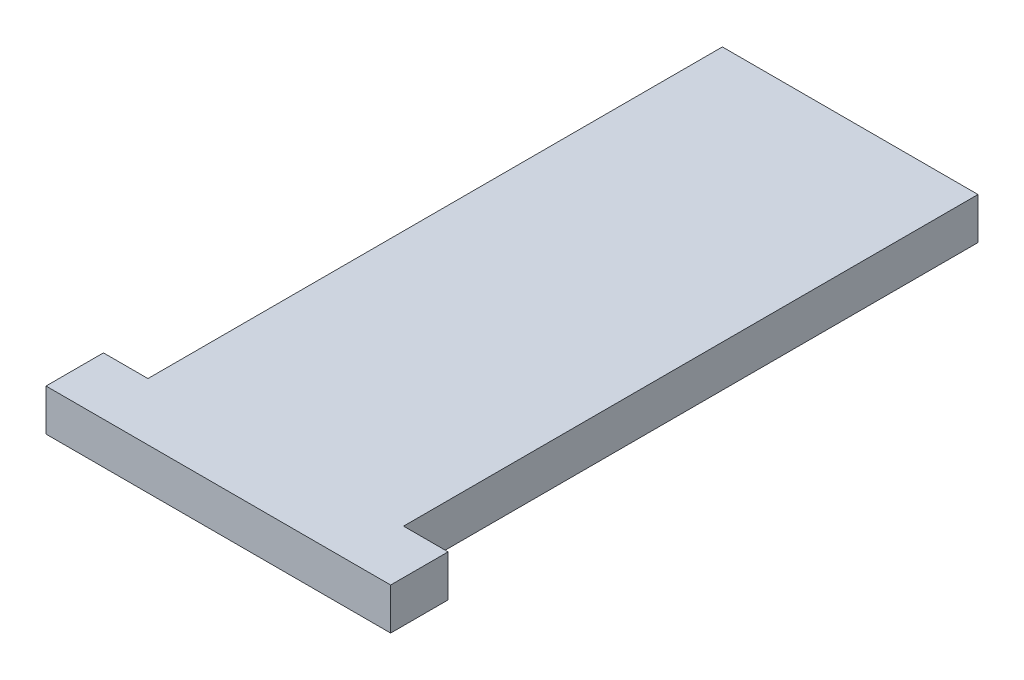
ISO-10303-21;
HEADER;
FILE_DESCRIPTION(('STEP AP214'),'2;1');
FILE_NAME('part.step','',(''),(''),'','','');
FILE_SCHEMA(('AUTOMOTIVE_DESIGN { 1 0 10303 214 1 1 1 1 }'));
ENDSEC;
DATA;
#1=APPLICATION_CONTEXT('core data for automotive mechanical design processes');
#2=APPLICATION_PROTOCOL_DEFINITION('international standard','automotive_design',2000,#1);
#3=PRODUCT_CONTEXT('',#1,'mechanical');
#4=PRODUCT('Part','Part','',(#3));
#5=PRODUCT_RELATED_PRODUCT_CATEGORY('part','',(#4));
#6=PRODUCT_DEFINITION_FORMATION('','',#4);
#7=PRODUCT_DEFINITION_CONTEXT('part definition',#1,'design');
#8=PRODUCT_DEFINITION('design','',#6,#7);
#9=PRODUCT_DEFINITION_SHAPE('','',#8);
#10=(LENGTH_UNIT() NAMED_UNIT(*) SI_UNIT(.MILLI.,.METRE.));
#11=(NAMED_UNIT(*) PLANE_ANGLE_UNIT() SI_UNIT($,.RADIAN.));
#12=(NAMED_UNIT(*) SI_UNIT($,.STERADIAN.) SOLID_ANGLE_UNIT());
#13=UNCERTAINTY_MEASURE_WITH_UNIT(LENGTH_MEASURE(1.E-05),#10,'distance_accuracy_value','');
#14=(GEOMETRIC_REPRESENTATION_CONTEXT(3) GLOBAL_UNCERTAINTY_ASSIGNED_CONTEXT((#13)) GLOBAL_UNIT_ASSIGNED_CONTEXT((#10,
#11,#12)) REPRESENTATION_CONTEXT('',''));
#15=CARTESIAN_POINT('',(0.,0.,0.));
#16=DIRECTION('',(0.,0.,1.));
#17=DIRECTION('',(1.,0.,0.));
#18=AXIS2_PLACEMENT_3D('',#15,#16,#17);
#19=CARTESIAN_POINT('',(0.,3.683,-5.08));
#20=DIRECTION('',(-1.,0.,0.));
#21=DIRECTION('',(0.,0.,1.));
#22=AXIS2_PLACEMENT_3D('',#19,#20,#21);
#23=PLANE('',#22);
#24=DIRECTION('',(0.,0.,-1.));
#25=VECTOR('',#24,1.);
#26=CARTESIAN_POINT('',(0.,0.,-5.08));
#27=LINE('',#26,#25);
#28=CARTESIAN_POINT('',(0.,0.,0.));
#29=VERTEX_POINT('',#28);
#30=CARTESIAN_POINT('',(0.,0.,-5.08));
#31=VERTEX_POINT('',#30);
#32=EDGE_CURVE('E146',#29,#31,#27,.T.);
#33=ORIENTED_EDGE('',*,*,#32,.T.);
#34=DIRECTION('',(0.,-1.,0.));
#35=VECTOR('',#34,1.);
#36=CARTESIAN_POINT('',(0.,3.683,-5.08));
#37=LINE('',#36,#35);
#38=CARTESIAN_POINT('',(0.,3.683,-5.08));
#39=VERTEX_POINT('',#38);
#40=EDGE_CURVE('E11',#39,#31,#37,.T.);
#41=ORIENTED_EDGE('',*,*,#40,.F.);
#42=DIRECTION('',(0.,0.,-1.));
#43=VECTOR('',#42,1.);
#44=CARTESIAN_POINT('',(0.,3.683,-5.08));
#45=LINE('',#44,#43);
#46=CARTESIAN_POINT('',(0.,3.683,0.));
#47=VERTEX_POINT('',#46);
#48=EDGE_CURVE('E168',#47,#39,#45,.T.);
#49=ORIENTED_EDGE('',*,*,#48,.F.);
#50=DIRECTION('',(0.,-1.,0.));
#51=VECTOR('',#50,1.);
#52=CARTESIAN_POINT('',(0.,3.683,0.));
#53=LINE('',#52,#51);
#54=EDGE_CURVE('E142',#47,#29,#53,.T.);
#55=ORIENTED_EDGE('',*,*,#54,.T.);
#56=EDGE_LOOP('',(#33,#41,#49,#55));
#57=FACE_BOUND('',#56,.T.);
#58=ADVANCED_FACE('F45',(#57),#23,.F.);
#59=CARTESIAN_POINT('',(-3.937,3.683,-5.08));
#60=DIRECTION('',(0.,0.,1.));
#61=DIRECTION('',(1.,0.,0.));
#62=AXIS2_PLACEMENT_3D('',#59,#60,#61);
#63=PLANE('',#62);
#64=DIRECTION('',(-1.,0.,0.));
#65=VECTOR('',#64,1.);
#66=CARTESIAN_POINT('',(-3.937,0.,-5.08));
#67=LINE('',#66,#65);
#68=CARTESIAN_POINT('',(-3.937,0.,-5.08));
#69=VERTEX_POINT('',#68);
#70=EDGE_CURVE('E150',#31,#69,#67,.T.);
#71=ORIENTED_EDGE('',*,*,#70,.T.);
#72=DIRECTION('',(0.,-1.,0.));
#73=VECTOR('',#72,1.);
#74=CARTESIAN_POINT('',(-3.937,3.683,-5.08));
#75=LINE('',#74,#73);
#76=CARTESIAN_POINT('',(-3.937,3.683,-5.08));
#77=VERTEX_POINT('',#76);
#78=EDGE_CURVE('E54',#77,#69,#75,.T.);
#79=ORIENTED_EDGE('',*,*,#78,.F.);
#80=DIRECTION('',(-1.,0.,0.));
#81=VECTOR('',#80,1.);
#82=CARTESIAN_POINT('',(-3.937,3.683,-5.08));
#83=LINE('',#82,#81);
#84=EDGE_CURVE('E105',#39,#77,#83,.T.);
#85=ORIENTED_EDGE('',*,*,#84,.F.);
#86=ORIENTED_EDGE('',*,*,#40,.T.);
#87=EDGE_LOOP('',(#71,#79,#85,#86));
#88=FACE_BOUND('',#87,.T.);
#89=ADVANCED_FACE('F214',(#88),#63,.F.);
#90=CARTESIAN_POINT('',(-3.937,3.683,-55.88));
#91=DIRECTION('',(-1.,0.,0.));
#92=DIRECTION('',(0.,0.,1.));
#93=AXIS2_PLACEMENT_3D('',#90,#91,#92);
#94=PLANE('',#93);
#95=DIRECTION('',(0.,0.,-1.));
#96=VECTOR('',#95,1.);
#97=CARTESIAN_POINT('',(-3.937,0.,-55.88));
#98=LINE('',#97,#96);
#99=CARTESIAN_POINT('',(-3.937,0.,-55.88));
#100=VERTEX_POINT('',#99);
#101=EDGE_CURVE('E153',#69,#100,#98,.T.);
#102=ORIENTED_EDGE('',*,*,#101,.T.);
#103=DIRECTION('',(0.,-1.,0.));
#104=VECTOR('',#103,1.);
#105=CARTESIAN_POINT('',(-3.937,3.683,-55.88));
#106=LINE('',#105,#104);
#107=CARTESIAN_POINT('',(-3.937,3.683,-55.88));
#108=VERTEX_POINT('',#107);
#109=EDGE_CURVE('E179',#108,#100,#106,.T.);
#110=ORIENTED_EDGE('',*,*,#109,.F.);
#111=DIRECTION('',(0.,0.,-1.));
#112=VECTOR('',#111,1.);
#113=CARTESIAN_POINT('',(-3.937,3.683,-55.88));
#114=LINE('',#113,#112);
#115=EDGE_CURVE('E189',#77,#108,#114,.T.);
#116=ORIENTED_EDGE('',*,*,#115,.F.);
#117=ORIENTED_EDGE('',*,*,#78,.T.);
#118=EDGE_LOOP('',(#102,#110,#116,#117));
#119=FACE_BOUND('',#118,.T.);
#120=ADVANCED_FACE('F187',(#119),#94,.F.);
#121=CARTESIAN_POINT('',(-26.543,3.683,-55.88));
#122=DIRECTION('',(0.,0.,1.));
#123=DIRECTION('',(1.,0.,0.));
#124=AXIS2_PLACEMENT_3D('',#121,#122,#123);
#125=PLANE('',#124);
#126=DIRECTION('',(-1.,0.,0.));
#127=VECTOR('',#126,1.);
#128=CARTESIAN_POINT('',(-26.543,0.,-55.88));
#129=LINE('',#128,#127);
#130=CARTESIAN_POINT('',(-26.543,0.,-55.88));
#131=VERTEX_POINT('',#130);
#132=EDGE_CURVE('E156',#100,#131,#129,.T.);
#133=ORIENTED_EDGE('',*,*,#132,.T.);
#134=DIRECTION('',(0.,-1.,0.));
#135=VECTOR('',#134,1.);
#136=CARTESIAN_POINT('',(-26.543,3.683,-55.88));
#137=LINE('',#136,#135);
#138=CARTESIAN_POINT('',(-26.543,3.683,-55.88));
#139=VERTEX_POINT('',#138);
#140=EDGE_CURVE('E175',#139,#131,#137,.T.);
#141=ORIENTED_EDGE('',*,*,#140,.F.);
#142=DIRECTION('',(-1.,0.,0.));
#143=VECTOR('',#142,1.);
#144=CARTESIAN_POINT('',(-26.543,3.683,-55.88));
#145=LINE('',#144,#143);
#146=EDGE_CURVE('E202',#108,#139,#145,.T.);
#147=ORIENTED_EDGE('',*,*,#146,.F.);
#148=ORIENTED_EDGE('',*,*,#109,.T.);
#149=EDGE_LOOP('',(#133,#141,#147,#148));
#150=FACE_BOUND('',#149,.T.);
#151=ADVANCED_FACE('F197',(#150),#125,.F.);
#152=CARTESIAN_POINT('',(-26.543,3.683,-5.08));
#153=DIRECTION('',(1.,0.,0.));
#154=DIRECTION('',(0.,0.,-1.));
#155=AXIS2_PLACEMENT_3D('',#152,#153,#154);
#156=PLANE('',#155);
#157=DIRECTION('',(0.,0.,1.));
#158=VECTOR('',#157,1.);
#159=CARTESIAN_POINT('',(-26.543,0.,-5.08));
#160=LINE('',#159,#158);
#161=CARTESIAN_POINT('',(-26.543,0.,-5.08));
#162=VERTEX_POINT('',#161);
#163=EDGE_CURVE('E159',#131,#162,#160,.T.);
#164=ORIENTED_EDGE('',*,*,#163,.T.);
#165=DIRECTION('',(0.,-1.,0.));
#166=VECTOR('',#165,1.);
#167=CARTESIAN_POINT('',(-26.543,3.683,-5.08));
#168=LINE('',#167,#166);
#169=CARTESIAN_POINT('',(-26.543,3.683,-5.08));
#170=VERTEX_POINT('',#169);
#171=EDGE_CURVE('E135',#170,#162,#168,.T.);
#172=ORIENTED_EDGE('',*,*,#171,.F.);
#173=DIRECTION('',(0.,0.,1.));
#174=VECTOR('',#173,1.);
#175=CARTESIAN_POINT('',(-26.543,3.683,-5.08));
#176=LINE('',#175,#174);
#177=EDGE_CURVE('E124',#139,#170,#176,.T.);
#178=ORIENTED_EDGE('',*,*,#177,.F.);
#179=ORIENTED_EDGE('',*,*,#140,.T.);
#180=EDGE_LOOP('',(#164,#172,#178,#179));
#181=FACE_BOUND('',#180,.T.);
#182=ADVANCED_FACE('F200',(#181),#156,.F.);
#183=CARTESIAN_POINT('',(-30.48,3.683,-5.08));
#184=DIRECTION('',(0.,0.,1.));
#185=DIRECTION('',(1.,0.,0.));
#186=AXIS2_PLACEMENT_3D('',#183,#184,#185);
#187=PLANE('',#186);
#188=DIRECTION('',(-1.,0.,0.));
#189=VECTOR('',#188,1.);
#190=CARTESIAN_POINT('',(-30.48,0.,-5.08));
#191=LINE('',#190,#189);
#192=CARTESIAN_POINT('',(-30.48,0.,-5.08));
#193=VERTEX_POINT('',#192);
#194=EDGE_CURVE('E133',#162,#193,#191,.T.);
#195=ORIENTED_EDGE('',*,*,#194,.T.);
#196=DIRECTION('',(0.,-1.,0.));
#197=VECTOR('',#196,1.);
#198=CARTESIAN_POINT('',(-30.48,3.683,-5.08));
#199=LINE('',#198,#197);
#200=CARTESIAN_POINT('',(-30.48,3.683,-5.08));
#201=VERTEX_POINT('',#200);
#202=EDGE_CURVE('E130',#201,#193,#199,.T.);
#203=ORIENTED_EDGE('',*,*,#202,.F.);
#204=DIRECTION('',(-1.,0.,0.));
#205=VECTOR('',#204,1.);
#206=CARTESIAN_POINT('',(-30.48,3.683,-5.08));
#207=LINE('',#206,#205);
#208=EDGE_CURVE('E118',#170,#201,#207,.T.);
#209=ORIENTED_EDGE('',*,*,#208,.F.);
#210=ORIENTED_EDGE('',*,*,#171,.T.);
#211=EDGE_LOOP('',(#195,#203,#209,#210));
#212=FACE_BOUND('',#211,.T.);
#213=ADVANCED_FACE('F131',(#212),#187,.F.);
#214=CARTESIAN_POINT('',(-30.48,3.683,0.));
#215=DIRECTION('',(1.,0.,0.));
#216=DIRECTION('',(0.,0.,-1.));
#217=AXIS2_PLACEMENT_3D('',#214,#215,#216);
#218=PLANE('',#217);
#219=DIRECTION('',(0.,0.,1.));
#220=VECTOR('',#219,1.);
#221=CARTESIAN_POINT('',(-30.48,0.,0.));
#222=LINE('',#221,#220);
#223=CARTESIAN_POINT('',(-30.48,0.,0.));
#224=VERTEX_POINT('',#223);
#225=EDGE_CURVE('E91',#193,#224,#222,.T.);
#226=ORIENTED_EDGE('',*,*,#225,.T.);
#227=DIRECTION('',(0.,-1.,0.));
#228=VECTOR('',#227,1.);
#229=CARTESIAN_POINT('',(-30.48,3.683,0.));
#230=LINE('',#229,#228);
#231=CARTESIAN_POINT('',(-30.48,3.683,0.));
#232=VERTEX_POINT('',#231);
#233=EDGE_CURVE('E136',#232,#224,#230,.T.);
#234=ORIENTED_EDGE('',*,*,#233,.F.);
#235=DIRECTION('',(0.,0.,1.));
#236=VECTOR('',#235,1.);
#237=CARTESIAN_POINT('',(-30.48,3.683,0.));
#238=LINE('',#237,#236);
#239=EDGE_CURVE('E122',#201,#232,#238,.T.);
#240=ORIENTED_EDGE('',*,*,#239,.F.);
#241=ORIENTED_EDGE('',*,*,#202,.T.);
#242=EDGE_LOOP('',(#226,#234,#240,#241));
#243=FACE_BOUND('',#242,.T.);
#244=ADVANCED_FACE('F138',(#243),#218,.F.);
#245=CARTESIAN_POINT('',(0.,3.683,0.));
#246=DIRECTION('',(0.,0.,-1.));
#247=DIRECTION('',(-1.,0.,0.));
#248=AXIS2_PLACEMENT_3D('',#245,#246,#247);
#249=PLANE('',#248);
#250=DIRECTION('',(1.,0.,0.));
#251=VECTOR('',#250,1.);
#252=CARTESIAN_POINT('',(0.,0.,0.));
#253=LINE('',#252,#251);
#254=EDGE_CURVE('E97',#224,#29,#253,.T.);
#255=ORIENTED_EDGE('',*,*,#254,.T.);
#256=ORIENTED_EDGE('',*,*,#54,.F.);
#257=DIRECTION('',(1.,0.,0.));
#258=VECTOR('',#257,1.);
#259=CARTESIAN_POINT('',(0.,3.683,0.));
#260=LINE('',#259,#258);
#261=EDGE_CURVE('E62',#232,#47,#260,.T.);
#262=ORIENTED_EDGE('',*,*,#261,.F.);
#263=ORIENTED_EDGE('',*,*,#233,.T.);
#264=EDGE_LOOP('',(#255,#256,#262,#263));
#265=FACE_BOUND('',#264,.T.);
#266=ADVANCED_FACE('F230',(#265),#249,.F.);
#267=CARTESIAN_POINT('',(0.,3.683,0.));
#268=DIRECTION('',(0.,-1.,0.));
#269=DIRECTION('',(0.,0.,-1.));
#270=AXIS2_PLACEMENT_3D('',#267,#268,#269);
#271=PLANE('',#270);
#272=ORIENTED_EDGE('',*,*,#48,.T.);
#273=ORIENTED_EDGE('',*,*,#84,.T.);
#274=ORIENTED_EDGE('',*,*,#115,.T.);
#275=ORIENTED_EDGE('',*,*,#146,.T.);
#276=ORIENTED_EDGE('',*,*,#177,.T.);
#277=ORIENTED_EDGE('',*,*,#208,.T.);
#278=ORIENTED_EDGE('',*,*,#239,.T.);
#279=ORIENTED_EDGE('',*,*,#261,.T.);
#280=EDGE_LOOP('',(#272,#273,#274,#275,#276,#277,#278,#279));
#281=FACE_BOUND('',#280,.T.);
#282=ADVANCED_FACE('F120',(#281),#271,.F.);
#283=CARTESIAN_POINT('',(0.,0.,0.));
#284=DIRECTION('',(0.,-1.,0.));
#285=DIRECTION('',(0.,0.,-1.));
#286=AXIS2_PLACEMENT_3D('',#283,#284,#285);
#287=PLANE('',#286);
#288=ORIENTED_EDGE('',*,*,#32,.F.);
#289=ORIENTED_EDGE('',*,*,#254,.F.);
#290=ORIENTED_EDGE('',*,*,#225,.F.);
#291=ORIENTED_EDGE('',*,*,#194,.F.);
#292=ORIENTED_EDGE('',*,*,#163,.F.);
#293=ORIENTED_EDGE('',*,*,#132,.F.);
#294=ORIENTED_EDGE('',*,*,#101,.F.);
#295=ORIENTED_EDGE('',*,*,#70,.F.);
#296=EDGE_LOOP('',(#288,#289,#290,#291,#292,#293,#294,#295));
#297=FACE_BOUND('',#296,.T.);
#298=ADVANCED_FACE('F193',(#297),#287,.T.);
#299=CLOSED_SHELL('',(#58,#89,#120,#151,#182,#213,#244,#266,#282,#298));
#300=MANIFOLD_SOLID_BREP('B2',#299);
#301=ADVANCED_BREP_SHAPE_REPRESENTATION('',(#18,#300),#14);
#302=SHAPE_DEFINITION_REPRESENTATION(#9,#301);
ENDSEC;
END-ISO-10303-21;
